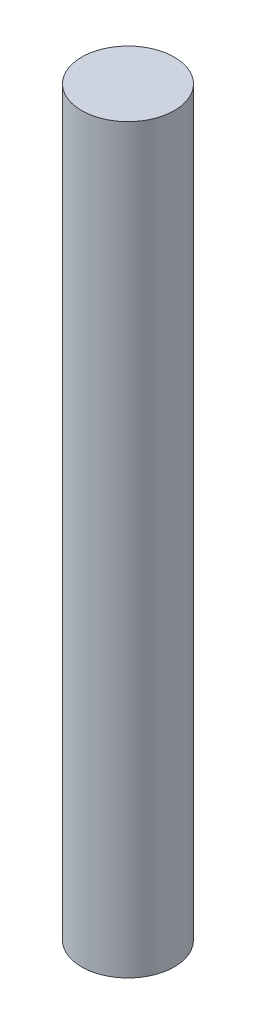
ISO-10303-21;
HEADER;
FILE_DESCRIPTION(('STEP AP214'),'2;1');
FILE_NAME('part.step','',(''),(''),'','','');
FILE_SCHEMA(('AUTOMOTIVE_DESIGN { 1 0 10303 214 1 1 1 1 }'));
ENDSEC;
DATA;
#1=APPLICATION_CONTEXT('core data for automotive mechanical design processes');
#2=APPLICATION_PROTOCOL_DEFINITION('international standard','automotive_design',2000,#1);
#3=PRODUCT_CONTEXT('',#1,'mechanical');
#4=PRODUCT('Part','Part','',(#3));
#5=PRODUCT_RELATED_PRODUCT_CATEGORY('part','',(#4));
#6=PRODUCT_DEFINITION_FORMATION('','',#4);
#7=PRODUCT_DEFINITION_CONTEXT('part definition',#1,'design');
#8=PRODUCT_DEFINITION('design','',#6,#7);
#9=PRODUCT_DEFINITION_SHAPE('','',#8);
#10=(LENGTH_UNIT() NAMED_UNIT(*) SI_UNIT(.MILLI.,.METRE.));
#11=(NAMED_UNIT(*) PLANE_ANGLE_UNIT() SI_UNIT($,.RADIAN.));
#12=(NAMED_UNIT(*) SI_UNIT($,.STERADIAN.) SOLID_ANGLE_UNIT());
#13=UNCERTAINTY_MEASURE_WITH_UNIT(LENGTH_MEASURE(1.E-05),#10,'distance_accuracy_value','');
#14=(GEOMETRIC_REPRESENTATION_CONTEXT(3) GLOBAL_UNCERTAINTY_ASSIGNED_CONTEXT((#13)) GLOBAL_UNIT_ASSIGNED_CONTEXT((#10,
#11,#12)) REPRESENTATION_CONTEXT('',''));
#15=CARTESIAN_POINT('',(0.,0.,0.));
#16=DIRECTION('',(0.,0.,1.));
#17=DIRECTION('',(1.,0.,0.));
#18=AXIS2_PLACEMENT_3D('',#15,#16,#17);
#19=CARTESIAN_POINT('',(0.,40.,0.));
#20=DIRECTION('',(0.,-1.,0.));
#21=DIRECTION('',(0.,0.,-1.));
#22=AXIS2_PLACEMENT_3D('',#19,#20,#21);
#23=CYLINDRICAL_SURFACE('',#22,2.5);
#24=CARTESIAN_POINT('',(0.,40.,0.));
#25=DIRECTION('',(0.,1.,0.));
#26=DIRECTION('',(0.,0.,1.));
#27=AXIS2_PLACEMENT_3D('',#24,#25,#26);
#28=CIRCLE('',#27,2.5);
#29=CARTESIAN_POINT('',(0.,40.,2.5));
#30=VERTEX_POINT('',#29);
#31=EDGE_CURVE('E10',#30,#30,#28,.T.);
#32=ORIENTED_EDGE('',*,*,#31,.F.);
#33=EDGE_LOOP('',(#32));
#34=FACE_BOUND('',#33,.T.);
#35=CARTESIAN_POINT('',(0.,0.,0.));
#36=DIRECTION('',(0.,1.,0.));
#37=DIRECTION('',(0.,0.,1.));
#38=AXIS2_PLACEMENT_3D('',#35,#36,#37);
#39=CIRCLE('',#38,2.5);
#40=CARTESIAN_POINT('',(0.,0.,2.5));
#41=VERTEX_POINT('',#40);
#42=EDGE_CURVE('E36',#41,#41,#39,.T.);
#43=ORIENTED_EDGE('',*,*,#42,.T.);
#44=EDGE_LOOP('',(#43));
#45=FACE_BOUND('',#44,.T.);
#46=ADVANCED_FACE('F33',(#34,#45),#23,.T.);
#47=CARTESIAN_POINT('',(0.,40.,0.));
#48=DIRECTION('',(0.,1.,0.));
#49=DIRECTION('',(0.,0.,1.));
#50=AXIS2_PLACEMENT_3D('',#47,#48,#49);
#51=PLANE('',#50);
#52=ORIENTED_EDGE('',*,*,#31,.T.);
#53=EDGE_LOOP('',(#52));
#54=FACE_BOUND('',#53,.T.);
#55=ADVANCED_FACE('F48',(#54),#51,.T.);
#56=CARTESIAN_POINT('',(0.,0.,0.));
#57=DIRECTION('',(0.,1.,0.));
#58=DIRECTION('',(0.,0.,1.));
#59=AXIS2_PLACEMENT_3D('',#56,#57,#58);
#60=PLANE('',#59);
#61=ORIENTED_EDGE('',*,*,#42,.F.);
#62=EDGE_LOOP('',(#61));
#63=FACE_BOUND('',#62,.T.);
#64=ADVANCED_FACE('F46',(#63),#60,.F.);
#65=CLOSED_SHELL('',(#46,#55,#64));
#66=MANIFOLD_SOLID_BREP('B2',#65);
#67=ADVANCED_BREP_SHAPE_REPRESENTATION('',(#18,#66),#14);
#68=SHAPE_DEFINITION_REPRESENTATION(#9,#67);
ENDSEC;
END-ISO-10303-21;
